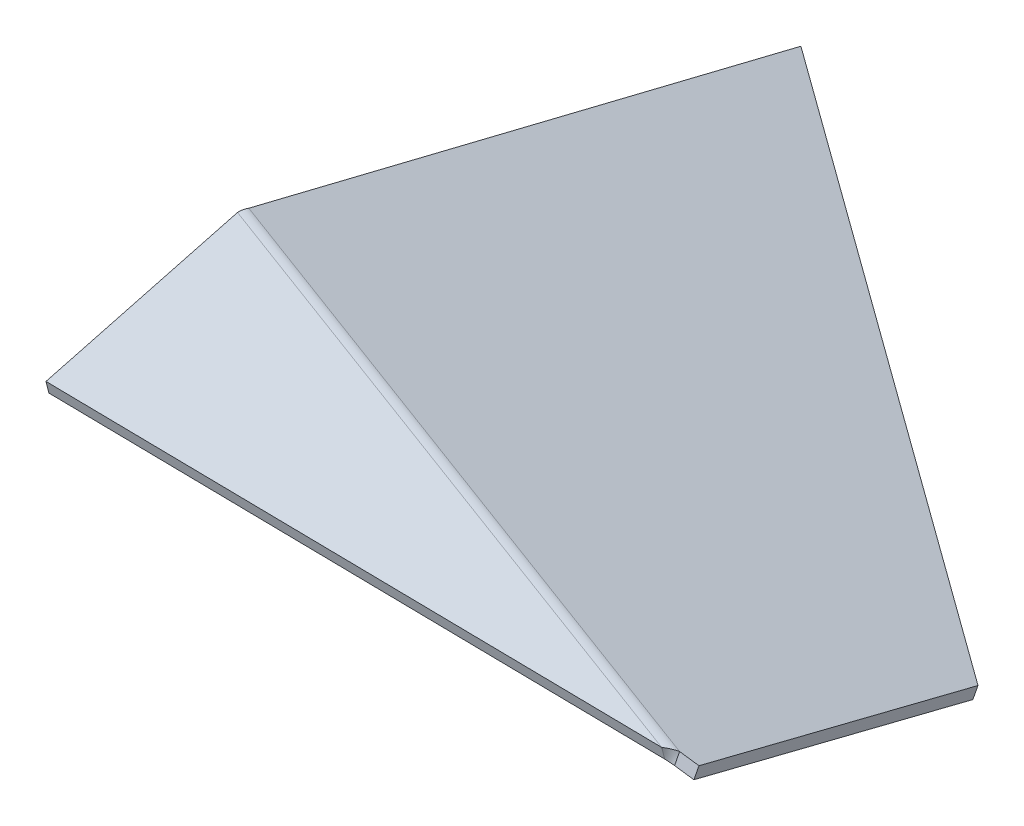
ISO-10303-21;
HEADER;
FILE_DESCRIPTION(('STEP AP214'),'2;1');
FILE_NAME('part.step','',(''),(''),'','','');
FILE_SCHEMA(('AUTOMOTIVE_DESIGN { 1 0 10303 214 1 1 1 1 }'));
ENDSEC;
DATA;
#1=APPLICATION_CONTEXT('core data for automotive mechanical design processes');
#2=APPLICATION_PROTOCOL_DEFINITION('international standard','automotive_design',2000,#1);
#3=PRODUCT_CONTEXT('',#1,'mechanical');
#4=PRODUCT('Part','Part','',(#3));
#5=PRODUCT_RELATED_PRODUCT_CATEGORY('part','',(#4));
#6=PRODUCT_DEFINITION_FORMATION('','',#4);
#7=PRODUCT_DEFINITION_CONTEXT('part definition',#1,'design');
#8=PRODUCT_DEFINITION('design','',#6,#7);
#9=PRODUCT_DEFINITION_SHAPE('','',#8);
#10=(LENGTH_UNIT() NAMED_UNIT(*) SI_UNIT(.MILLI.,.METRE.));
#11=(NAMED_UNIT(*) PLANE_ANGLE_UNIT() SI_UNIT($,.RADIAN.));
#12=(NAMED_UNIT(*) SI_UNIT($,.STERADIAN.) SOLID_ANGLE_UNIT());
#13=UNCERTAINTY_MEASURE_WITH_UNIT(LENGTH_MEASURE(1.E-05),#10,'distance_accuracy_value','');
#14=(GEOMETRIC_REPRESENTATION_CONTEXT(3) GLOBAL_UNCERTAINTY_ASSIGNED_CONTEXT((#13)) GLOBAL_UNIT_ASSIGNED_CONTEXT((#10,
#11,#12)) REPRESENTATION_CONTEXT('',''));
#15=CARTESIAN_POINT('',(0.,0.,0.));
#16=DIRECTION('',(0.,0.,1.));
#17=DIRECTION('',(1.,0.,0.));
#18=AXIS2_PLACEMENT_3D('',#15,#16,#17);
#19=CARTESIAN_POINT('',(213.276332963954,21.4476733494272,83.9168581145864));
#20=DIRECTION('',(-0.560258328399562,0.296049146874039,0.773605524860107));
#21=DIRECTION('',(0.809911671635238,0.,0.586551859726839));
#22=AXIS2_PLACEMENT_3D('',#19,#20,#21);
#23=PLANE('',#22);
#24=DIRECTION('',(-0.173648177666927,-0.955172708275919,0.239773659432811));
#25=VECTOR('',#24,1.);
#26=CARTESIAN_POINT('',(47.1027397153719,18.4150000000278,-35.2683289824618));
#27=LINE('',#26,#25);
#28=CARTESIAN_POINT('',(47.1027397153719,18.4150000000278,-35.2683289824618));
#29=VERTEX_POINT('',#28);
#30=CARTESIAN_POINT('',(47.6540726794644,21.4476733488038,-36.029610351161));
#31=VERTEX_POINT('',#30);
#32=EDGE_CURVE('E128',#29,#31,#27,.F.);
#33=ORIENTED_EDGE('',*,*,#32,.T.);
#34=DIRECTION('',(-0.809911671635793,-3.04839956705311E-12,-0.586551859726074));
#35=VECTOR('',#34,1.);
#36=CARTESIAN_POINT('',(213.276332963954,21.4476733494272,83.9168581145864));
#37=LINE('',#36,#35);
#38=CARTESIAN_POINT('',(213.276332963954,21.4476733494272,83.9168581145864));
#39=VERTEX_POINT('',#38);
#40=EDGE_CURVE('E153',#39,#31,#37,.T.);
#41=ORIENTED_EDGE('',*,*,#40,.F.);
#42=DIRECTION('',(-0.173648177666927,-0.955172708275919,0.239773659432811));
#43=VECTOR('',#42,1.);
#44=CARTESIAN_POINT('',(213.276332963954,21.4476733494272,83.9168581145864));
#45=LINE('',#44,#43);
#46=CARTESIAN_POINT('',(212.724999999862,18.4150000006512,84.6781394832856));
#47=VERTEX_POINT('',#46);
#48=EDGE_CURVE('E11',#39,#47,#45,.T.);
#49=ORIENTED_EDGE('',*,*,#48,.T.);
#50=DIRECTION('',(-0.809911671635793,-3.04839956705311E-12,-0.586551859726074));
#51=VECTOR('',#50,1.);
#52=CARTESIAN_POINT('',(212.724999999862,18.4150000006512,84.6781394832856));
#53=LINE('',#52,#51);
#54=EDGE_CURVE('E141',#47,#29,#53,.T.);
#55=ORIENTED_EDGE('',*,*,#54,.T.);
#56=EDGE_LOOP('',(#33,#41,#49,#55));
#57=FACE_BOUND('',#56,.T.);
#58=ADVANCED_FACE('F41',(#57),#23,.F.);
#59=CARTESIAN_POINT('',(6.49448120033597,35.7236757696964,-8.96758920504777));
#60=DIRECTION('',(0.173648177666927,0.955172708275919,-0.239773659432811));
#61=DIRECTION('',(0.,0.243472554617306,0.969907786930347));
#62=AXIS2_PLACEMENT_3D('',#59,#60,#61);
#63=PLANE('',#62);
#64=ORIENTED_EDGE('',*,*,#40,.T.);
#65=DIRECTION('',(-0.00530487508157586,-0.242561777639079,-0.970121457513924));
#66=VECTOR('',#65,1.);
#67=CARTESIAN_POINT('',(47.8105554253837,28.6027396673014,-7.4130515797375));
#68=LINE('',#67,#66);
#69=CARTESIAN_POINT('',(48.436956055082,57.2444791837691,107.139069351673));
#70=VERTEX_POINT('',#69);
#71=EDGE_CURVE('E172',#70,#31,#68,.T.);
#72=ORIENTED_EDGE('',*,*,#71,.F.);
#73=DIRECTION('',(0.951455726899335,-0.0998924667666156,0.291124534922323));
#74=VECTOR('',#73,1.);
#75=CARTESIAN_POINT('',(-782.769268967056,144.512060703106,-147.191761650527));
#76=LINE('',#75,#74);
#77=CARTESIAN_POINT('',(208.537574305365,40.4356616678984,156.126338765441));
#78=VERTEX_POINT('',#77);
#79=EDGE_CURVE('E137',#70,#78,#76,.T.);
#80=ORIENTED_EDGE('',*,*,#79,.T.);
#81=DIRECTION('',(-0.980169043350741,0.191232873776429,0.0519483824974413));
#82=VECTOR('',#81,1.);
#83=CARTESIAN_POINT('',(23.7179422325592,76.4943289063185,165.921670504478));
#84=LINE('',#83,#82);
#85=CARTESIAN_POINT('',(213.276332963954,39.5111206996211,155.875187345154));
#86=VERTEX_POINT('',#85);
#87=EDGE_CURVE('E183',#86,#78,#84,.T.);
#88=ORIENTED_EDGE('',*,*,#87,.F.);
#89=DIRECTION('',(0.,-0.243472554617306,-0.969907786930347));
#90=VECTOR('',#89,1.);
#91=CARTESIAN_POINT('',(213.276332963954,40.0416730556623,157.988718631287));
#92=LINE('',#91,#90);
#93=EDGE_CURVE('E48',#86,#39,#92,.T.);
#94=ORIENTED_EDGE('',*,*,#93,.T.);
#95=EDGE_LOOP('',(#64,#72,#80,#88,#94));
#96=FACE_BOUND('',#95,.T.);
#97=ADVANCED_FACE('F205',(#96),#63,.T.);
#98=CARTESIAN_POINT('',(5.94314823624348,32.6910024209204,-8.20630783634859));
#99=DIRECTION('',(0.173648177666927,0.955172708275919,-0.239773659432811));
#100=DIRECTION('',(0.,0.243472554617306,0.969907786930347));
#101=AXIS2_PLACEMENT_3D('',#98,#99,#100);
#102=PLANE('',#101);
#103=DIRECTION('',(-0.00530487508157586,-0.242561777639079,-0.970121457513924));
#104=VECTOR('',#103,1.);
#105=CARTESIAN_POINT('',(47.2592224612912,25.5700663185254,-6.65177021103832));
#106=LINE('',#105,#104);
#107=CARTESIAN_POINT('',(47.8856230909895,54.211805834993,107.900350720373));
#108=VERTEX_POINT('',#107);
#109=EDGE_CURVE('E169',#108,#29,#106,.T.);
#110=ORIENTED_EDGE('',*,*,#109,.T.);
#111=ORIENTED_EDGE('',*,*,#54,.F.);
#112=DIRECTION('',(0.,-0.243472554617306,-0.969907786930347));
#113=VECTOR('',#112,1.);
#114=CARTESIAN_POINT('',(212.724999999862,37.0089997068862,158.749999999987));
#115=LINE('',#114,#113);
#116=CARTESIAN_POINT('',(212.724999999862,36.478447350845,156.636468713853));
#117=VERTEX_POINT('',#116);
#118=EDGE_CURVE('E145',#117,#47,#115,.T.);
#119=ORIENTED_EDGE('',*,*,#118,.F.);
#120=DIRECTION('',(-0.980169043350741,0.191232873776429,0.0519483824974413));
#121=VECTOR('',#120,1.);
#122=CARTESIAN_POINT('',(23.1666092684667,73.4616555575424,166.682951873177));
#123=LINE('',#122,#121);
#124=CARTESIAN_POINT('',(207.986241341273,37.4029883191224,156.88762013414));
#125=VERTEX_POINT('',#124);
#126=EDGE_CURVE('E138',#117,#125,#123,.T.);
#127=ORIENTED_EDGE('',*,*,#126,.T.);
#128=DIRECTION('',(0.951455726899335,-0.0998924667666156,0.291124534922323));
#129=VECTOR('',#128,1.);
#130=CARTESIAN_POINT('',(-783.320601931149,141.47938735433,-146.430480281828));
#131=LINE('',#130,#129);
#132=EDGE_CURVE('E150',#108,#125,#131,.T.);
#133=ORIENTED_EDGE('',*,*,#132,.F.);
#134=EDGE_LOOP('',(#110,#111,#119,#127,#133));
#135=FACE_BOUND('',#134,.T.);
#136=ADVANCED_FACE('F167',(#135),#102,.F.);
#137=CARTESIAN_POINT('',(23.368908449987,38.9693308259468,178.892547083856));
#138=DIRECTION('',(-0.021100642376261,-0.96481241224478,-0.262091152215632));
#139=DIRECTION('',(0.,0.262149518059748,-0.965027269138568));
#140=AXIS2_PLACEMENT_3D('',#137,#138,#139);
#141=PLANE('',#140);
#142=DIRECTION('',(0.999777356660626,-0.0203626952894326,-0.00553152322968801));
#143=VECTOR('',#142,1.);
#144=CARTESIAN_POINT('',(23.368908449987,44.4285260211537,158.796106434576));
#145=LINE('',#144,#143);
#146=CARTESIAN_POINT('',(47.660840297768,43.9337666600693,158.66170512571));
#147=VERTEX_POINT('',#146);
#148=CARTESIAN_POINT('',(205.567041669212,40.7176547513356,157.788048790948));
#149=VERTEX_POINT('',#148);
#150=EDGE_CURVE('E127',#147,#149,#145,.T.);
#151=ORIENTED_EDGE('',*,*,#150,.T.);
#152=DIRECTION('',(0.951455726899335,-0.0998924667666156,0.291124534922323));
#153=VECTOR('',#152,1.);
#154=CARTESIAN_POINT('',(46.6408477933867,57.4031705260126,109.160127416348));
#155=LINE('',#154,#153);
#156=CARTESIAN_POINT('',(47.9524073669517,57.2654710856595,109.561435811559));
#157=VERTEX_POINT('',#156);
#158=EDGE_CURVE('E135',#157,#149,#155,.T.);
#159=ORIENTED_EDGE('',*,*,#158,.F.);
#160=DIRECTION('',(-0.00573061611962936,-0.262028494840937,0.96504312231645));
#161=VECTOR('',#160,1.);
#162=CARTESIAN_POINT('',(47.5407055738805,38.4406887394337,178.892547083856));
#163=LINE('',#162,#161);
#164=EDGE_CURVE('E121',#157,#147,#163,.T.);
#165=ORIENTED_EDGE('',*,*,#164,.T.);
#166=EDGE_LOOP('',(#151,#159,#165));
#167=FACE_BOUND('',#166,.T.);
#168=ADVANCED_FACE('F140',(#167),#141,.F.);
#169=CARTESIAN_POINT('',(23.3019139104424,35.9060514170696,178.060407675571));
#170=DIRECTION('',(-0.021100642376261,-0.96481241224478,-0.262091152215632));
#171=DIRECTION('',(0.,0.262149518059748,-0.965027269138568));
#172=AXIS2_PLACEMENT_3D('',#169,#170,#171);
#173=PLANE('',#172);
#174=DIRECTION('',(0.951455726899335,-0.0998924667666156,0.291124534922323));
#175=VECTOR('',#174,1.);
#176=CARTESIAN_POINT('',(46.573853253842,54.3398911171354,108.327988008063));
#177=LINE('',#176,#175);
#178=CARTESIAN_POINT('',(47.8854128274071,54.2021916767823,108.729296403275));
#179=VERTEX_POINT('',#178);
#180=CARTESIAN_POINT('',(205.500047129667,37.6543753424585,156.955909382664));
#181=VERTEX_POINT('',#180);
#182=EDGE_CURVE('E142',#179,#181,#177,.T.);
#183=ORIENTED_EDGE('',*,*,#182,.T.);
#184=DIRECTION('',(0.999777356660626,-0.0203626952894327,-0.0055315232296879));
#185=VECTOR('',#184,1.);
#186=CARTESIAN_POINT('',(23.3019139104424,41.3652466122765,157.963967026292));
#187=LINE('',#186,#185);
#188=CARTESIAN_POINT('',(47.5938457582234,40.8704872511921,157.829565717426));
#189=VERTEX_POINT('',#188);
#190=EDGE_CURVE('E117',#189,#181,#187,.T.);
#191=ORIENTED_EDGE('',*,*,#190,.F.);
#192=DIRECTION('',(-0.00573061611962936,-0.262028494840937,0.96504312231645));
#193=VECTOR('',#192,1.);
#194=CARTESIAN_POINT('',(47.4737110343359,35.3774093305565,178.060407675571));
#195=LINE('',#194,#193);
#196=EDGE_CURVE('E187',#179,#189,#195,.T.);
#197=ORIENTED_EDGE('',*,*,#196,.F.);
#198=EDGE_LOOP('',(#183,#191,#197));
#199=FACE_BOUND('',#198,.T.);
#200=ADVANCED_FACE('F214',(#199),#173,.T.);
#201=CARTESIAN_POINT('',(-783.583036422057,140.035834840313,-146.068110350327));
#202=DIRECTION('',(0.951455726899335,-0.0998924667666156,0.291124534922323));
#203=DIRECTION('',(0.292587990198667,0.,-0.956238604110661));
#204=AXIS2_PLACEMENT_3D('',#201,#202,#203);
#205=CYLINDRICAL_SURFACE('',#204,4.6863);
#206=CARTESIAN_POINT('',(47.8535234265839,52.7440706781568,108.333198044931));
#207=DIRECTION('',(0.977711487974954,-0.0746858678629199,0.196219946548161));
#208=DIRECTION('',(-0.20888994512209,-0.252109163498612,0.944884098980886));
#209=AXIS2_PLACEMENT_3D('',#206,#207,#208);
#210=ELLIPSE('',#209,4.71063423794903,4.6863);
#211=EDGE_CURVE('E110',#70,#157,#210,.T.);
#212=ORIENTED_EDGE('',*,*,#211,.T.);
#213=ORIENTED_EDGE('',*,*,#158,.T.);
#214=CARTESIAN_POINT('',(205.468157728844,36.1962543438329,156.55981102432));
#215=DIRECTION('',(-0.455979442097745,0.242583928229823,-0.856291881398404));
#216=DIRECTION('',(0.889740136936363,0.101439868606953,-0.445053302180161));
#217=AXIS2_PLACEMENT_3D('',#214,#215,#216);
#218=ELLIPSE('',#217,6.62501782757545,4.6863);
#219=EDGE_CURVE('E198',#149,#78,#218,.T.);
#220=ORIENTED_EDGE('',*,*,#219,.T.);
#221=ORIENTED_EDGE('',*,*,#79,.F.);
#222=EDGE_LOOP('',(#212,#213,#220,#221));
#223=FACE_BOUND('',#222,.T.);
#224=ADVANCED_FACE('F133',(#223),#205,.T.);
#225=CARTESIAN_POINT('',(-783.583036422057,140.035834840313,-146.068110350327));
#226=DIRECTION('',(0.951455726899335,-0.0998924667666156,0.291124534922323));
#227=DIRECTION('',(0.292587990198667,0.,-0.956238604110661));
#228=AXIS2_PLACEMENT_3D('',#225,#226,#227);
#229=CYLINDRICAL_SURFACE('',#228,1.5113);
#230=ORIENTED_EDGE('',*,*,#182,.F.);
#231=CARTESIAN_POINT('',(47.8535234265839,52.7440706781568,108.333198044931));
#232=DIRECTION('',(0.999760932888557,-0.0218649735833688,0.));
#233=DIRECTION('',(-0.00573061611962936,-0.262028494840937,0.96504312231645));
#234=AXIS2_PLACEMENT_3D('',#231,#232,#233);
#235=ELLIPSE('',#234,1.58514823399499,1.5113);
#236=EDGE_CURVE('E113',#108,#179,#235,.T.);
#237=ORIENTED_EDGE('',*,*,#236,.F.);
#238=ORIENTED_EDGE('',*,*,#132,.T.);
#239=CARTESIAN_POINT('',(205.468157728844,36.1962543438329,156.55981102432));
#240=DIRECTION('',(0.,0.262149518059748,-0.965027269138568));
#241=DIRECTION('',(0.999777356660626,-0.0203626952894326,-0.00553152322968801));
#242=AXIS2_PLACEMENT_3D('',#239,#240,#241);
#243=ELLIPSE('',#242,4.92071958311942,1.5113);
#244=EDGE_CURVE('E197',#181,#125,#243,.T.);
#245=ORIENTED_EDGE('',*,*,#244,.F.);
#246=EDGE_LOOP('',(#230,#237,#238,#245));
#247=FACE_BOUND('',#246,.T.);
#248=ADVANCED_FACE('F196',(#247),#229,.F.);
#249=CARTESIAN_POINT('',(213.276332963954,40.0416730556623,157.988718631287));
#250=DIRECTION('',(-0.984807753012209,0.168422719705417,-0.0422785654212066));
#251=DIRECTION('',(-0.168573447679442,-0.985689095373113,0.));
#252=AXIS2_PLACEMENT_3D('',#249,#250,#251);
#253=PLANE('',#252);
#254=DIRECTION('',(-0.173648177666927,-0.955172708275919,0.239773659432811));
#255=VECTOR('',#254,1.);
#256=CARTESIAN_POINT('',(212.724999999862,36.478447350845,156.636468713853));
#257=LINE('',#256,#255);
#258=EDGE_CURVE('E160',#117,#86,#257,.F.);
#259=ORIENTED_EDGE('',*,*,#258,.F.);
#260=ORIENTED_EDGE('',*,*,#118,.T.);
#261=ORIENTED_EDGE('',*,*,#48,.F.);
#262=ORIENTED_EDGE('',*,*,#93,.F.);
#263=EDGE_LOOP('',(#259,#260,#261,#262));
#264=FACE_BOUND('',#263,.T.);
#265=ADVANCED_FACE('F158',(#264),#253,.F.);
#266=CARTESIAN_POINT('',(23.368908449987,44.4285260211537,158.796106434576));
#267=DIRECTION('',(0.,0.262149518059748,-0.965027269138568));
#268=DIRECTION('',(0.999777356660626,-0.0203626952894326,-0.00553152322968801));
#269=AXIS2_PLACEMENT_3D('',#266,#267,#268);
#270=PLANE('',#269);
#271=DIRECTION('',(0.021100642376261,0.96481241224478,0.262091152215632));
#272=VECTOR('',#271,1.);
#273=CARTESIAN_POINT('',(205.567041669212,40.7176547513356,157.788048790948));
#274=LINE('',#273,#272);
#275=EDGE_CURVE('E55',#149,#181,#274,.F.);
#276=ORIENTED_EDGE('',*,*,#275,.F.);
#277=ORIENTED_EDGE('',*,*,#150,.F.);
#278=DIRECTION('',(0.021100642376261,0.96481241224478,0.262091152215632));
#279=VECTOR('',#278,1.);
#280=CARTESIAN_POINT('',(47.660840297768,43.9337666600693,158.66170512571));
#281=LINE('',#280,#279);
#282=EDGE_CURVE('E116',#147,#189,#281,.F.);
#283=ORIENTED_EDGE('',*,*,#282,.T.);
#284=ORIENTED_EDGE('',*,*,#190,.T.);
#285=EDGE_LOOP('',(#276,#277,#283,#284));
#286=FACE_BOUND('',#285,.T.);
#287=ADVANCED_FACE('F217',(#286),#270,.F.);
#288=CARTESIAN_POINT('',(47.5407055738805,38.4406887394337,178.892547083856));
#289=DIRECTION('',(0.999760932888557,-0.0218649735833688,0.));
#290=DIRECTION('',(-0.00573061611962936,-0.262028494840937,0.96504312231645));
#291=AXIS2_PLACEMENT_3D('',#288,#289,#290);
#292=PLANE('',#291);
#293=ORIENTED_EDGE('',*,*,#282,.F.);
#294=ORIENTED_EDGE('',*,*,#164,.F.);
#295=DIRECTION('',(0.021100642376261,0.96481241224478,0.262091152215632));
#296=VECTOR('',#295,1.);
#297=CARTESIAN_POINT('',(47.9524073669518,57.2654710856595,109.561435811559));
#298=LINE('',#297,#296);
#299=EDGE_CURVE('E105',#157,#179,#298,.F.);
#300=ORIENTED_EDGE('',*,*,#299,.T.);
#301=ORIENTED_EDGE('',*,*,#196,.T.);
#302=EDGE_LOOP('',(#293,#294,#300,#301));
#303=FACE_BOUND('',#302,.T.);
#304=ADVANCED_FACE('F122',(#303),#292,.F.);
#305=CARTESIAN_POINT('',(47.2592224612912,25.5700663185254,-6.65177021103832));
#306=DIRECTION('',(0.984793464993206,-0.16973179252402,0.0370533387599422));
#307=DIRECTION('',(-0.00530487508157586,-0.242561777639079,-0.970121457513924));
#308=AXIS2_PLACEMENT_3D('',#305,#306,#307);
#309=PLANE('',#308);
#310=ORIENTED_EDGE('',*,*,#32,.F.);
#311=ORIENTED_EDGE('',*,*,#109,.F.);
#312=DIRECTION('',(-0.173648177666927,-0.955172708275919,0.239773659432811));
#313=VECTOR('',#312,1.);
#314=CARTESIAN_POINT('',(47.8856230909895,54.211805834993,107.900350720373));
#315=LINE('',#314,#313);
#316=EDGE_CURVE('E175',#108,#70,#315,.F.);
#317=ORIENTED_EDGE('',*,*,#316,.T.);
#318=ORIENTED_EDGE('',*,*,#71,.T.);
#319=EDGE_LOOP('',(#310,#311,#317,#318));
#320=FACE_BOUND('',#319,.T.);
#321=ADVANCED_FACE('F297',(#320),#309,.F.);
#322=CARTESIAN_POINT('',(47.8444395505622,52.3287166723033,109.862934446));
#323=CARTESIAN_POINT('',(47.5194661334176,52.0713033218287,110.836690108162));
#324=CARTESIAN_POINT('',(47.194492716273,51.8138899713541,111.810445770323));
#325=CARTESIAN_POINT('',(46.8695192991285,51.5564766208795,112.784201432484));
#326=CARTESIAN_POINT('',(47.7806607489157,49.4124746750522,109.070737729313));
#327=CARTESIAN_POINT('',(47.411024305408,47.1128750519929,109.489733785952));
#328=CARTESIAN_POINT('',(47.0413878619004,44.8132754289335,109.90872984259));
#329=CARTESIAN_POINT('',(46.6717514183927,42.5136758058741,110.327725899228));
#330=CARTESIAN_POINT('',(47.7988285009591,50.2431826867592,106.011264927175));
#331=CARTESIAN_POINT('',(48.0791388917406,48.458409764649,104.482749659491));
#332=CARTESIAN_POINT('',(48.3594492825221,46.6736368425388,102.954234391807));
#333=CARTESIAN_POINT('',(48.6397596733036,44.8888639204286,101.425719124122));
#334=CARTESIAN_POINT('',(47.8626073026056,53.1594246840102,106.803461643862));
#335=CARTESIAN_POINT('',(48.1875807197502,53.4168380344848,105.829705981701));
#336=CARTESIAN_POINT('',(48.5125541368947,53.6742513849594,104.85595031954));
#337=CARTESIAN_POINT('',(48.8375275540393,53.931664735434,103.882194657378));
#338=CARTESIAN_POINT('',(47.9263861042521,56.0756666812613,107.595658360549));
#339=CARTESIAN_POINT('',(48.2960225477598,58.3752663043207,107.176662303911));
#340=CARTESIAN_POINT('',(48.6656589912674,60.6748659273801,106.757666247273));
#341=CARTESIAN_POINT('',(49.0352954347751,62.9744655504394,106.338670190634));
#342=CARTESIAN_POINT('',(47.9082183522086,55.2449586695544,110.655131162687));
#343=CARTESIAN_POINT('',(47.6279079614272,57.0297315916646,112.183646430372));
#344=CARTESIAN_POINT('',(47.3475975706457,58.8145045137748,113.712161698056));
#345=CARTESIAN_POINT('',(47.0672871798642,60.5992774358849,115.24067696574));
#346=CARTESIAN_POINT('',(47.8444395505622,52.3287166723033,109.862934446));
#347=CARTESIAN_POINT('',(47.5194661334176,52.0713033218287,110.836690108162));
#348=CARTESIAN_POINT('',(47.194492716273,51.8138899713541,111.810445770323));
#349=CARTESIAN_POINT('',(46.8695192991285,51.5564766208795,112.784201432484));
#350=(BOUNDED_SURFACE() B_SPLINE_SURFACE(3,3,((#322,#323,#324,#325),(#326,#327,#328,#329),(#330,
#331,#332,#333),(#334,#335,#336,#337),(#338,#339,#340,#341),(#342,#343,#344,#345),(#346,#347,
#348,#349)),.UNSPECIFIED.,.T.,.F.,.F.) B_SPLINE_SURFACE_WITH_KNOTS((4,3,4),(4,4),(0.,0.5,1.),
(0.,1.),.UNSPECIFIED.) GEOMETRIC_REPRESENTATION_ITEM() RATIONAL_B_SPLINE_SURFACE(((1.,1.,1.,1.),
(0.333333333333333,0.333333333333333,0.333333333333333,0.333333333333333),(0.333333333333333,
0.333333333333333,0.333333333333333,0.333333333333333),(1.,1.,1.,1.),(0.333333333333333,
0.333333333333333,0.333333333333333,0.333333333333333),(0.333333333333333,0.333333333333333,
0.333333333333333,0.333333333333333),(1.,1.,1.,1.))) REPRESENTATION_ITEM('') SURFACE());
#351=ORIENTED_EDGE('',*,*,#236,.T.);
#352=ORIENTED_EDGE('',*,*,#299,.F.);
#353=ORIENTED_EDGE('',*,*,#211,.F.);
#354=ORIENTED_EDGE('',*,*,#316,.F.);
#355=EDGE_LOOP('',(#351,#352,#353,#354));
#356=FACE_BOUND('',#355,.T.);
#357=ADVANCED_FACE('F107',(#356),#350,.T.);
#358=CARTESIAN_POINT('',(23.1666092684667,73.4616555575424,166.682951873177));
#359=DIRECTION('',(-0.0954722831498616,-0.22599797643354,-0.969437959746831));
#360=DIRECTION('',(-0.980169043350741,0.191232873776429,0.0519483824974413));
#361=AXIS2_PLACEMENT_3D('',#358,#359,#360);
#362=PLANE('',#361);
#363=DIRECTION('',(-0.173648177666927,-0.955172708275919,0.239773659432811));
#364=VECTOR('',#363,1.);
#365=CARTESIAN_POINT('',(207.986241341273,37.4029883191224,156.88762013414));
#366=LINE('',#365,#364);
#367=EDGE_CURVE('E173',#125,#78,#366,.F.);
#368=ORIENTED_EDGE('',*,*,#367,.F.);
#369=ORIENTED_EDGE('',*,*,#126,.F.);
#370=ORIENTED_EDGE('',*,*,#258,.T.);
#371=ORIENTED_EDGE('',*,*,#87,.T.);
#372=EDGE_LOOP('',(#368,#369,#370,#371));
#373=FACE_BOUND('',#372,.T.);
#374=ADVANCED_FACE('F204',(#373),#362,.F.);
#375=CARTESIAN_POINT('',(210.387781746523,36.0960552303571,156.53259194964));
#376=CARTESIAN_POINT('',(210.712755163668,36.3534685808317,155.558836287478));
#377=CARTESIAN_POINT('',(211.037728580812,36.6108819313063,154.585080625317));
#378=CARTESIAN_POINT('',(211.362701997957,36.8682952817809,153.611324963155));
#379=CARTESIAN_POINT('',(210.324002944877,33.179813233106,155.740395232953));
#380=CARTESIAN_POINT('',(210.604313335658,31.3950403109959,154.211879965268));
#381=CARTESIAN_POINT('',(210.88462372644,29.6102673888857,152.683364697584));
#382=CARTESIAN_POINT('',(211.164934117221,27.8254944667755,151.154849429899));
#383=CARTESIAN_POINT('',(200.484754909518,33.3802114600577,155.794833382314));
#384=CARTESIAN_POINT('',(200.115118466011,31.0806118369983,156.213829438953));
#385=CARTESIAN_POINT('',(199.745482022503,28.7810122139389,156.632825495591));
#386=CARTESIAN_POINT('',(199.375845578995,26.4814125908795,157.051821552229));
#387=CARTESIAN_POINT('',(200.548533711165,36.2964534573087,156.587030099001));
#388=CARTESIAN_POINT('',(200.22356029402,36.0390401068341,157.560785761162));
#389=CARTESIAN_POINT('',(199.898586876876,35.7816267563595,158.534541423324));
#390=CARTESIAN_POINT('',(199.573613459731,35.5242134058849,159.508297085485));
#391=CARTESIAN_POINT('',(200.612312512811,39.2126954545598,157.379226815688));
#392=CARTESIAN_POINT('',(200.33200212203,40.99746837667,158.907742083373));
#393=CARTESIAN_POINT('',(200.051691731248,42.7822412987802,160.436257351057));
#394=CARTESIAN_POINT('',(199.771381340467,44.5670142208904,161.964772618741));
#395=CARTESIAN_POINT('',(210.45156054817,39.0122972276082,157.324788666326));
#396=CARTESIAN_POINT('',(210.821196991677,41.3118968506676,156.905792609688));
#397=CARTESIAN_POINT('',(211.190833435185,43.611496473727,156.48679655305));
#398=CARTESIAN_POINT('',(211.560469878692,45.9110960967863,156.067800496412));
#399=CARTESIAN_POINT('',(210.387781746523,36.0960552303571,156.53259194964));
#400=CARTESIAN_POINT('',(210.712755163668,36.3534685808317,155.558836287478));
#401=CARTESIAN_POINT('',(211.037728580812,36.6108819313063,154.585080625317));
#402=CARTESIAN_POINT('',(211.362701997957,36.8682952817809,153.611324963155));
#403=(BOUNDED_SURFACE() B_SPLINE_SURFACE(3,3,((#375,#376,#377,#378),(#379,#380,#381,#382),(#383,
#384,#385,#386),(#387,#388,#389,#390),(#391,#392,#393,#394),(#395,#396,#397,#398),(#399,#400,
#401,#402)),.UNSPECIFIED.,.T.,.F.,.F.) B_SPLINE_SURFACE_WITH_KNOTS((4,3,4),(4,4),(0.,0.5,1.),
(0.,1.),.UNSPECIFIED.) GEOMETRIC_REPRESENTATION_ITEM() RATIONAL_B_SPLINE_SURFACE(((1.,1.,1.,1.),
(0.333333333333333,0.333333333333333,0.333333333333333,0.333333333333333),(0.333333333333333,
0.333333333333333,0.333333333333333,0.333333333333333),(1.,1.,1.,1.),(0.333333333333333,
0.333333333333333,0.333333333333333,0.333333333333333),(0.333333333333333,0.333333333333333,
0.333333333333333,0.333333333333333),(1.,1.,1.,1.))) REPRESENTATION_ITEM('') SURFACE());
#404=ORIENTED_EDGE('',*,*,#244,.T.);
#405=ORIENTED_EDGE('',*,*,#367,.T.);
#406=ORIENTED_EDGE('',*,*,#219,.F.);
#407=ORIENTED_EDGE('',*,*,#275,.T.);
#408=EDGE_LOOP('',(#404,#405,#406,#407));
#409=FACE_BOUND('',#408,.T.);
#410=ADVANCED_FACE('F202',(#409),#403,.T.);
#411=CLOSED_SHELL('',(#58,#97,#136,#168,#200,#224,#248,#265,#287,#304,#321,#357,#374,#410));
#412=MANIFOLD_SOLID_BREP('B2',#411);
#413=ADVANCED_BREP_SHAPE_REPRESENTATION('',(#18,#412),#14);
#414=SHAPE_DEFINITION_REPRESENTATION(#9,#413);
ENDSEC;
END-ISO-10303-21;
